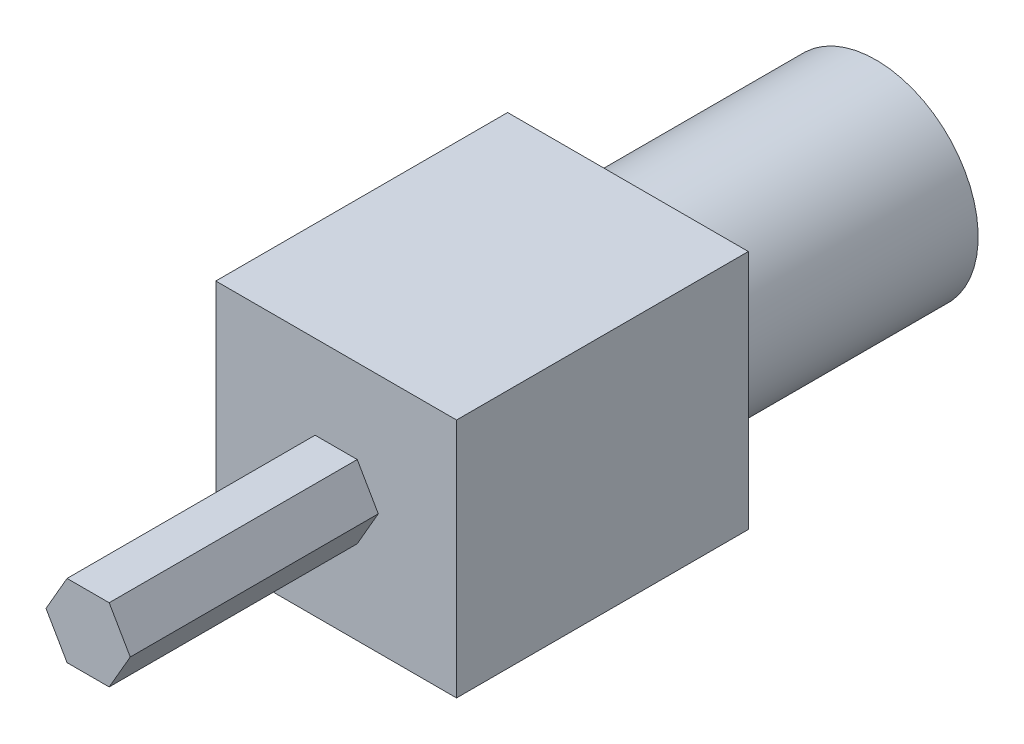
ISO-10303-21;
HEADER;
FILE_DESCRIPTION(('STEP AP214'),'2;1');
FILE_NAME('part.step','',(''),(''),'','','');
FILE_SCHEMA(('AUTOMOTIVE_DESIGN { 1 0 10303 214 1 1 1 1 }'));
ENDSEC;
DATA;
#1=APPLICATION_CONTEXT('core data for automotive mechanical design processes');
#2=APPLICATION_PROTOCOL_DEFINITION('international standard','automotive_design',2000,#1);
#3=PRODUCT_CONTEXT('',#1,'mechanical');
#4=PRODUCT('Part','Part','',(#3));
#5=PRODUCT_RELATED_PRODUCT_CATEGORY('part','',(#4));
#6=PRODUCT_DEFINITION_FORMATION('','',#4);
#7=PRODUCT_DEFINITION_CONTEXT('part definition',#1,'design');
#8=PRODUCT_DEFINITION('design','',#6,#7);
#9=PRODUCT_DEFINITION_SHAPE('','',#8);
#10=(LENGTH_UNIT() NAMED_UNIT(*) SI_UNIT(.MILLI.,.METRE.));
#11=(NAMED_UNIT(*) PLANE_ANGLE_UNIT() SI_UNIT($,.RADIAN.));
#12=(NAMED_UNIT(*) SI_UNIT($,.STERADIAN.) SOLID_ANGLE_UNIT());
#13=UNCERTAINTY_MEASURE_WITH_UNIT(LENGTH_MEASURE(1.E-05),#10,'distance_accuracy_value','');
#14=(GEOMETRIC_REPRESENTATION_CONTEXT(3) GLOBAL_UNCERTAINTY_ASSIGNED_CONTEXT((#13)) GLOBAL_UNIT_ASSIGNED_CONTEXT((#10,
#11,#12)) REPRESENTATION_CONTEXT('',''));
#15=CARTESIAN_POINT('',(0.,0.,0.));
#16=DIRECTION('',(0.,0.,1.));
#17=DIRECTION('',(1.,0.,0.));
#18=AXIS2_PLACEMENT_3D('',#15,#16,#17);
#19=CARTESIAN_POINT('',(0.,41.91,0.));
#20=DIRECTION('',(0.,0.,-1.));
#21=DIRECTION('',(-1.,0.,0.));
#22=AXIS2_PLACEMENT_3D('',#19,#20,#21);
#23=PLANE('',#22);
#24=DIRECTION('',(1.,0.,0.));
#25=VECTOR('',#24,1.);
#26=CARTESIAN_POINT('',(0.,0.,0.));
#27=LINE('',#26,#25);
#28=CARTESIAN_POINT('',(-41.91,0.,0.));
#29=VERTEX_POINT('',#28);
#30=CARTESIAN_POINT('',(0.,0.,0.));
#31=VERTEX_POINT('',#30);
#32=EDGE_CURVE('E161',#29,#31,#27,.T.);
#33=ORIENTED_EDGE('',*,*,#32,.T.);
#34=DIRECTION('',(0.,-1.,0.));
#35=VECTOR('',#34,1.);
#36=CARTESIAN_POINT('',(0.,41.91,0.));
#37=LINE('',#36,#35);
#38=CARTESIAN_POINT('',(0.,41.91,0.));
#39=VERTEX_POINT('',#38);
#40=EDGE_CURVE('E170',#39,#31,#37,.T.);
#41=ORIENTED_EDGE('',*,*,#40,.F.);
#42=DIRECTION('',(1.,0.,0.));
#43=VECTOR('',#42,1.);
#44=CARTESIAN_POINT('',(0.,41.91,0.));
#45=LINE('',#44,#43);
#46=CARTESIAN_POINT('',(-41.91,41.91,0.));
#47=VERTEX_POINT('',#46);
#48=EDGE_CURVE('E167',#47,#39,#45,.T.);
#49=ORIENTED_EDGE('',*,*,#48,.F.);
#50=DIRECTION('',(0.,-1.,0.));
#51=VECTOR('',#50,1.);
#52=CARTESIAN_POINT('',(-41.91,41.91,0.));
#53=LINE('',#52,#51);
#54=EDGE_CURVE('E185',#47,#29,#53,.T.);
#55=ORIENTED_EDGE('',*,*,#54,.T.);
#56=EDGE_LOOP('',(#33,#41,#49,#55));
#57=FACE_BOUND('',#56,.T.);
#58=DIRECTION('',(0.5,0.866025403784439,0.));
#59=VECTOR('',#58,1.);
#60=CARTESIAN_POINT('',(-17.2888257906459,14.605,0.));
#61=LINE('',#60,#59);
#62=CARTESIAN_POINT('',(-17.2888257906459,14.605,0.));
#63=VERTEX_POINT('',#62);
#64=CARTESIAN_POINT('',(-13.6226515812917,20.955,0.));
#65=VERTEX_POINT('',#64);
#66=EDGE_CURVE('E60',#63,#65,#61,.T.);
#67=ORIENTED_EDGE('',*,*,#66,.F.);
#68=DIRECTION('',(1.,0.,0.));
#69=VECTOR('',#68,1.);
#70=CARTESIAN_POINT('',(-24.6211742093541,14.605,0.));
#71=LINE('',#70,#69);
#72=CARTESIAN_POINT('',(-24.6211742093541,14.605,0.));
#73=VERTEX_POINT('',#72);
#74=EDGE_CURVE('E64',#73,#63,#71,.T.);
#75=ORIENTED_EDGE('',*,*,#74,.F.);
#76=DIRECTION('',(0.5,-0.866025403784438,0.));
#77=VECTOR('',#76,1.);
#78=CARTESIAN_POINT('',(-28.2873484187082,20.955,0.));
#79=LINE('',#78,#77);
#80=CARTESIAN_POINT('',(-28.2873484187082,20.955,0.));
#81=VERTEX_POINT('',#80);
#82=EDGE_CURVE('E382',#81,#73,#79,.T.);
#83=ORIENTED_EDGE('',*,*,#82,.F.);
#84=DIRECTION('',(-0.5,-0.866025403784439,0.));
#85=VECTOR('',#84,1.);
#86=CARTESIAN_POINT('',(-24.6211742093541,27.305,0.));
#87=LINE('',#86,#85);
#88=CARTESIAN_POINT('',(-24.6211742093541,27.305,0.));
#89=VERTEX_POINT('',#88);
#90=EDGE_CURVE('E402',#89,#81,#87,.T.);
#91=ORIENTED_EDGE('',*,*,#90,.F.);
#92=DIRECTION('',(-1.,0.,0.));
#93=VECTOR('',#92,1.);
#94=CARTESIAN_POINT('',(-17.2888257906459,27.305,0.));
#95=LINE('',#94,#93);
#96=CARTESIAN_POINT('',(-17.2888257906459,27.305,0.));
#97=VERTEX_POINT('',#96);
#98=EDGE_CURVE('E405',#97,#89,#95,.T.);
#99=ORIENTED_EDGE('',*,*,#98,.F.);
#100=DIRECTION('',(-0.5,0.866025403784438,0.));
#101=VECTOR('',#100,1.);
#102=CARTESIAN_POINT('',(-13.6226515812917,20.955,0.));
#103=LINE('',#102,#101);
#104=EDGE_CURVE('E407',#65,#97,#103,.T.);
#105=ORIENTED_EDGE('',*,*,#104,.F.);
#106=EDGE_LOOP('',(#67,#75,#83,#91,#99,#105));
#107=FACE_BOUND('',#106,.T.);
#108=ADVANCED_FACE('F43',(#57,#107),#23,.F.);
#109=CARTESIAN_POINT('',(0.,41.91,0.));
#110=DIRECTION('',(-1.,0.,0.));
#111=DIRECTION('',(0.,0.,1.));
#112=AXIS2_PLACEMENT_3D('',#109,#110,#111);
#113=PLANE('',#112);
#114=DIRECTION('',(0.,0.,-1.));
#115=VECTOR('',#114,1.);
#116=CARTESIAN_POINT('',(0.,0.,0.));
#117=LINE('',#116,#115);
#118=CARTESIAN_POINT('',(0.,0.,-50.8));
#119=VERTEX_POINT('',#118);
#120=EDGE_CURVE('E150',#31,#119,#117,.T.);
#121=ORIENTED_EDGE('',*,*,#120,.T.);
#122=DIRECTION('',(0.,-1.,0.));
#123=VECTOR('',#122,1.);
#124=CARTESIAN_POINT('',(0.,41.91,-50.8));
#125=LINE('',#124,#123);
#126=CARTESIAN_POINT('',(0.,41.91,-50.8));
#127=VERTEX_POINT('',#126);
#128=EDGE_CURVE('E47',#127,#119,#125,.T.);
#129=ORIENTED_EDGE('',*,*,#128,.F.);
#130=DIRECTION('',(0.,0.,-1.));
#131=VECTOR('',#130,1.);
#132=CARTESIAN_POINT('',(0.,41.91,0.));
#133=LINE('',#132,#131);
#134=EDGE_CURVE('E156',#39,#127,#133,.T.);
#135=ORIENTED_EDGE('',*,*,#134,.F.);
#136=ORIENTED_EDGE('',*,*,#40,.T.);
#137=EDGE_LOOP('',(#121,#129,#135,#136));
#138=FACE_BOUND('',#137,.T.);
#139=ADVANCED_FACE('F45',(#138),#113,.F.);
#140=CARTESIAN_POINT('',(0.,41.91,-50.8));
#141=DIRECTION('',(0.,0.,1.));
#142=DIRECTION('',(1.,0.,0.));
#143=AXIS2_PLACEMENT_3D('',#140,#141,#142);
#144=PLANE('',#143);
#145=CARTESIAN_POINT('',(-20.955,20.955,-50.8));
#146=DIRECTION('',(0.,0.,-1.));
#147=DIRECTION('',(-1.,0.,0.));
#148=AXIS2_PLACEMENT_3D('',#145,#146,#147);
#149=CIRCLE('',#148,17.78);
#150=CARTESIAN_POINT('',(-38.735,20.955,-50.8));
#151=VERTEX_POINT('',#150);
#152=EDGE_CURVE('E11',#151,#151,#149,.T.);
#153=ORIENTED_EDGE('',*,*,#152,.F.);
#154=EDGE_LOOP('',(#153));
#155=FACE_BOUND('',#154,.T.);
#156=DIRECTION('',(-1.,0.,0.));
#157=VECTOR('',#156,1.);
#158=CARTESIAN_POINT('',(0.,0.,-50.8));
#159=LINE('',#158,#157);
#160=CARTESIAN_POINT('',(-41.91,0.,-50.8));
#161=VERTEX_POINT('',#160);
#162=EDGE_CURVE('E174',#119,#161,#159,.T.);
#163=ORIENTED_EDGE('',*,*,#162,.T.);
#164=DIRECTION('',(0.,-1.,0.));
#165=VECTOR('',#164,1.);
#166=CARTESIAN_POINT('',(-41.91,41.91,-50.8));
#167=LINE('',#166,#165);
#168=CARTESIAN_POINT('',(-41.91,41.91,-50.8));
#169=VERTEX_POINT('',#168);
#170=EDGE_CURVE('E188',#169,#161,#167,.T.);
#171=ORIENTED_EDGE('',*,*,#170,.F.);
#172=DIRECTION('',(-1.,0.,0.));
#173=VECTOR('',#172,1.);
#174=CARTESIAN_POINT('',(0.,41.91,-50.8));
#175=LINE('',#174,#173);
#176=EDGE_CURVE('E160',#127,#169,#175,.T.);
#177=ORIENTED_EDGE('',*,*,#176,.F.);
#178=ORIENTED_EDGE('',*,*,#128,.T.);
#179=EDGE_LOOP('',(#163,#171,#177,#178));
#180=FACE_BOUND('',#179,.T.);
#181=ADVANCED_FACE('F199',(#155,#180),#144,.F.);
#182=CARTESIAN_POINT('',(-41.91,41.91,0.));
#183=DIRECTION('',(1.,0.,0.));
#184=DIRECTION('',(0.,0.,-1.));
#185=AXIS2_PLACEMENT_3D('',#182,#183,#184);
#186=PLANE('',#185);
#187=DIRECTION('',(0.,0.,1.));
#188=VECTOR('',#187,1.);
#189=CARTESIAN_POINT('',(-41.91,0.,0.));
#190=LINE('',#189,#188);
#191=EDGE_CURVE('E177',#161,#29,#190,.T.);
#192=ORIENTED_EDGE('',*,*,#191,.T.);
#193=ORIENTED_EDGE('',*,*,#54,.F.);
#194=DIRECTION('',(0.,0.,1.));
#195=VECTOR('',#194,1.);
#196=CARTESIAN_POINT('',(-41.91,41.91,0.));
#197=LINE('',#196,#195);
#198=EDGE_CURVE('E164',#169,#47,#197,.T.);
#199=ORIENTED_EDGE('',*,*,#198,.F.);
#200=ORIENTED_EDGE('',*,*,#170,.T.);
#201=EDGE_LOOP('',(#192,#193,#199,#200));
#202=FACE_BOUND('',#201,.T.);
#203=ADVANCED_FACE('F208',(#202),#186,.F.);
#204=CARTESIAN_POINT('',(0.,41.91,0.));
#205=DIRECTION('',(0.,1.,0.));
#206=DIRECTION('',(0.,0.,1.));
#207=AXIS2_PLACEMENT_3D('',#204,#205,#206);
#208=PLANE('',#207);
#209=ORIENTED_EDGE('',*,*,#134,.T.);
#210=ORIENTED_EDGE('',*,*,#176,.T.);
#211=ORIENTED_EDGE('',*,*,#198,.T.);
#212=ORIENTED_EDGE('',*,*,#48,.T.);
#213=EDGE_LOOP('',(#209,#210,#211,#212));
#214=FACE_BOUND('',#213,.T.);
#215=ADVANCED_FACE('F212',(#214),#208,.T.);
#216=CARTESIAN_POINT('',(0.,0.,0.));
#217=DIRECTION('',(0.,1.,0.));
#218=DIRECTION('',(0.,0.,1.));
#219=AXIS2_PLACEMENT_3D('',#216,#217,#218);
#220=PLANE('',#219);
#221=ORIENTED_EDGE('',*,*,#120,.F.);
#222=ORIENTED_EDGE('',*,*,#32,.F.);
#223=ORIENTED_EDGE('',*,*,#191,.F.);
#224=ORIENTED_EDGE('',*,*,#162,.F.);
#225=EDGE_LOOP('',(#221,#222,#223,#224));
#226=FACE_BOUND('',#225,.T.);
#227=ADVANCED_FACE('F206',(#226),#220,.F.);
#228=CARTESIAN_POINT('',(-20.955,20.955,-93.98));
#229=DIRECTION('',(0.,0.,1.));
#230=DIRECTION('',(1.,0.,0.));
#231=AXIS2_PLACEMENT_3D('',#228,#229,#230);
#232=CYLINDRICAL_SURFACE('',#231,17.78);
#233=CARTESIAN_POINT('',(-20.955,20.955,-93.98));
#234=DIRECTION('',(0.,0.,-1.));
#235=DIRECTION('',(-1.,0.,0.));
#236=AXIS2_PLACEMENT_3D('',#233,#234,#235);
#237=CIRCLE('',#236,17.78);
#238=CARTESIAN_POINT('',(-38.735,20.955,-93.98));
#239=VERTEX_POINT('',#238);
#240=EDGE_CURVE('E145',#239,#239,#237,.T.);
#241=ORIENTED_EDGE('',*,*,#240,.F.);
#242=EDGE_LOOP('',(#241));
#243=FACE_BOUND('',#242,.T.);
#244=ORIENTED_EDGE('',*,*,#152,.T.);
#245=EDGE_LOOP('',(#244));
#246=FACE_BOUND('',#245,.T.);
#247=ADVANCED_FACE('F219',(#243,#246),#232,.T.);
#248=CARTESIAN_POINT('',(-20.955,20.955,-93.98));
#249=DIRECTION('',(0.,0.,-1.));
#250=DIRECTION('',(-1.,0.,0.));
#251=AXIS2_PLACEMENT_3D('',#248,#249,#250);
#252=PLANE('',#251);
#253=ORIENTED_EDGE('',*,*,#240,.T.);
#254=EDGE_LOOP('',(#253));
#255=FACE_BOUND('',#254,.T.);
#256=ADVANCED_FACE('F235',(#255),#252,.T.);
#257=CARTESIAN_POINT('',(-17.2888257906459,14.605,43.18));
#258=DIRECTION('',(-0.866025403784439,0.5,0.));
#259=DIRECTION('',(-0.5,-0.866025403784439,0.));
#260=AXIS2_PLACEMENT_3D('',#257,#258,#259);
#261=PLANE('',#260);
#262=ORIENTED_EDGE('',*,*,#66,.T.);
#263=DIRECTION('',(0.,0.,-1.));
#264=VECTOR('',#263,1.);
#265=CARTESIAN_POINT('',(-13.6226515812917,20.955,43.18));
#266=LINE('',#265,#264);
#267=CARTESIAN_POINT('',(-13.6226515812917,20.955,43.18));
#268=VERTEX_POINT('',#267);
#269=EDGE_CURVE('E125',#268,#65,#266,.T.);
#270=ORIENTED_EDGE('',*,*,#269,.F.);
#271=DIRECTION('',(0.5,0.866025403784439,0.));
#272=VECTOR('',#271,1.);
#273=CARTESIAN_POINT('',(-17.2888257906459,14.605,43.18));
#274=LINE('',#273,#272);
#275=CARTESIAN_POINT('',(-17.2888257906459,14.605,43.18));
#276=VERTEX_POINT('',#275);
#277=EDGE_CURVE('E132',#276,#268,#274,.T.);
#278=ORIENTED_EDGE('',*,*,#277,.F.);
#279=DIRECTION('',(0.,0.,-1.));
#280=VECTOR('',#279,1.);
#281=CARTESIAN_POINT('',(-17.2888257906459,14.605,43.18));
#282=LINE('',#281,#280);
#283=EDGE_CURVE('E378',#276,#63,#282,.T.);
#284=ORIENTED_EDGE('',*,*,#283,.T.);
#285=EDGE_LOOP('',(#262,#270,#278,#284));
#286=FACE_BOUND('',#285,.T.);
#287=ADVANCED_FACE('F143',(#286),#261,.F.);
#288=CARTESIAN_POINT('',(-13.6226515812917,20.955,43.18));
#289=DIRECTION('',(-0.866025403784438,-0.5,0.));
#290=DIRECTION('',(0.5,-0.866025403784438,0.));
#291=AXIS2_PLACEMENT_3D('',#288,#289,#290);
#292=PLANE('',#291);
#293=ORIENTED_EDGE('',*,*,#104,.T.);
#294=DIRECTION('',(0.,0.,-1.));
#295=VECTOR('',#294,1.);
#296=CARTESIAN_POINT('',(-17.2888257906459,27.305,43.18));
#297=LINE('',#296,#295);
#298=CARTESIAN_POINT('',(-17.2888257906459,27.305,43.18));
#299=VERTEX_POINT('',#298);
#300=EDGE_CURVE('E127',#299,#97,#297,.T.);
#301=ORIENTED_EDGE('',*,*,#300,.F.);
#302=DIRECTION('',(-0.5,0.866025403784438,0.));
#303=VECTOR('',#302,1.);
#304=CARTESIAN_POINT('',(-13.6226515812917,20.955,43.18));
#305=LINE('',#304,#303);
#306=EDGE_CURVE('E120',#268,#299,#305,.T.);
#307=ORIENTED_EDGE('',*,*,#306,.F.);
#308=ORIENTED_EDGE('',*,*,#269,.T.);
#309=EDGE_LOOP('',(#293,#301,#307,#308));
#310=FACE_BOUND('',#309,.T.);
#311=ADVANCED_FACE('F123',(#310),#292,.F.);
#312=CARTESIAN_POINT('',(-17.2888257906459,27.305,43.18));
#313=DIRECTION('',(0.,-1.,0.));
#314=DIRECTION('',(0.,0.,-1.));
#315=AXIS2_PLACEMENT_3D('',#312,#313,#314);
#316=PLANE('',#315);
#317=ORIENTED_EDGE('',*,*,#98,.T.);
#318=DIRECTION('',(0.,0.,-1.));
#319=VECTOR('',#318,1.);
#320=CARTESIAN_POINT('',(-24.6211742093541,27.305,43.18));
#321=LINE('',#320,#319);
#322=CARTESIAN_POINT('',(-24.6211742093541,27.305,43.18));
#323=VERTEX_POINT('',#322);
#324=EDGE_CURVE('E152',#323,#89,#321,.T.);
#325=ORIENTED_EDGE('',*,*,#324,.F.);
#326=DIRECTION('',(-1.,0.,0.));
#327=VECTOR('',#326,1.);
#328=CARTESIAN_POINT('',(-17.2888257906459,27.305,43.18));
#329=LINE('',#328,#327);
#330=EDGE_CURVE('E131',#299,#323,#329,.T.);
#331=ORIENTED_EDGE('',*,*,#330,.F.);
#332=ORIENTED_EDGE('',*,*,#300,.T.);
#333=EDGE_LOOP('',(#317,#325,#331,#332));
#334=FACE_BOUND('',#333,.T.);
#335=ADVANCED_FACE('F248',(#334),#316,.F.);
#336=CARTESIAN_POINT('',(-24.6211742093541,27.305,43.18));
#337=DIRECTION('',(0.866025403784439,-0.499999999999999,0.));
#338=DIRECTION('',(0.5,0.866025403784439,0.));
#339=AXIS2_PLACEMENT_3D('',#336,#337,#338);
#340=PLANE('',#339);
#341=ORIENTED_EDGE('',*,*,#90,.T.);
#342=DIRECTION('',(0.,0.,-1.));
#343=VECTOR('',#342,1.);
#344=CARTESIAN_POINT('',(-28.2873484187082,20.955,43.18));
#345=LINE('',#344,#343);
#346=CARTESIAN_POINT('',(-28.2873484187082,20.955,43.18));
#347=VERTEX_POINT('',#346);
#348=EDGE_CURVE('E388',#347,#81,#345,.T.);
#349=ORIENTED_EDGE('',*,*,#348,.F.);
#350=DIRECTION('',(-0.5,-0.866025403784439,0.));
#351=VECTOR('',#350,1.);
#352=CARTESIAN_POINT('',(-24.6211742093541,27.305,43.18));
#353=LINE('',#352,#351);
#354=EDGE_CURVE('E403',#323,#347,#353,.T.);
#355=ORIENTED_EDGE('',*,*,#354,.F.);
#356=ORIENTED_EDGE('',*,*,#324,.T.);
#357=EDGE_LOOP('',(#341,#349,#355,#356));
#358=FACE_BOUND('',#357,.T.);
#359=ADVANCED_FACE('F251',(#358),#340,.F.);
#360=CARTESIAN_POINT('',(-28.2873484187082,20.955,43.18));
#361=DIRECTION('',(0.866025403784438,0.5,0.));
#362=DIRECTION('',(-0.5,0.866025403784438,0.));
#363=AXIS2_PLACEMENT_3D('',#360,#361,#362);
#364=PLANE('',#363);
#365=ORIENTED_EDGE('',*,*,#82,.T.);
#366=DIRECTION('',(0.,0.,-1.));
#367=VECTOR('',#366,1.);
#368=CARTESIAN_POINT('',(-24.6211742093541,14.605,43.18));
#369=LINE('',#368,#367);
#370=CARTESIAN_POINT('',(-24.6211742093541,14.605,43.18));
#371=VERTEX_POINT('',#370);
#372=EDGE_CURVE('E380',#371,#73,#369,.T.);
#373=ORIENTED_EDGE('',*,*,#372,.F.);
#374=DIRECTION('',(0.5,-0.866025403784438,0.));
#375=VECTOR('',#374,1.);
#376=CARTESIAN_POINT('',(-28.2873484187082,20.955,43.18));
#377=LINE('',#376,#375);
#378=EDGE_CURVE('E390',#347,#371,#377,.T.);
#379=ORIENTED_EDGE('',*,*,#378,.F.);
#380=ORIENTED_EDGE('',*,*,#348,.T.);
#381=EDGE_LOOP('',(#365,#373,#379,#380));
#382=FACE_BOUND('',#381,.T.);
#383=ADVANCED_FACE('F255',(#382),#364,.F.);
#384=CARTESIAN_POINT('',(-24.6211742093541,14.605,43.18));
#385=DIRECTION('',(0.,1.,0.));
#386=DIRECTION('',(-1.,0.,0.));
#387=AXIS2_PLACEMENT_3D('',#384,#385,#386);
#388=PLANE('',#387);
#389=ORIENTED_EDGE('',*,*,#74,.T.);
#390=ORIENTED_EDGE('',*,*,#283,.F.);
#391=DIRECTION('',(1.,0.,0.));
#392=VECTOR('',#391,1.);
#393=CARTESIAN_POINT('',(-24.6211742093541,14.605,43.18));
#394=LINE('',#393,#392);
#395=EDGE_CURVE('E137',#371,#276,#394,.T.);
#396=ORIENTED_EDGE('',*,*,#395,.F.);
#397=ORIENTED_EDGE('',*,*,#372,.T.);
#398=EDGE_LOOP('',(#389,#390,#396,#397));
#399=FACE_BOUND('',#398,.T.);
#400=ADVANCED_FACE('F259',(#399),#388,.F.);
#401=CARTESIAN_POINT('',(0.,0.,43.18));
#402=DIRECTION('',(0.,0.,1.));
#403=DIRECTION('',(1.,0.,0.));
#404=AXIS2_PLACEMENT_3D('',#401,#402,#403);
#405=PLANE('',#404);
#406=ORIENTED_EDGE('',*,*,#277,.T.);
#407=ORIENTED_EDGE('',*,*,#306,.T.);
#408=ORIENTED_EDGE('',*,*,#330,.T.);
#409=ORIENTED_EDGE('',*,*,#354,.T.);
#410=ORIENTED_EDGE('',*,*,#378,.T.);
#411=ORIENTED_EDGE('',*,*,#395,.T.);
#412=EDGE_LOOP('',(#406,#407,#408,#409,#410,#411));
#413=FACE_BOUND('',#412,.T.);
#414=ADVANCED_FACE('F135',(#413),#405,.T.);
#415=CLOSED_SHELL('',(#108,#139,#181,#203,#215,#227,#247,#256,#287,#311,#335,#359,#383,#400,#414));
#416=MANIFOLD_SOLID_BREP('B2',#415);
#417=ADVANCED_BREP_SHAPE_REPRESENTATION('',(#18,#416),#14);
#418=SHAPE_DEFINITION_REPRESENTATION(#9,#417);
ENDSEC;
END-ISO-10303-21;
